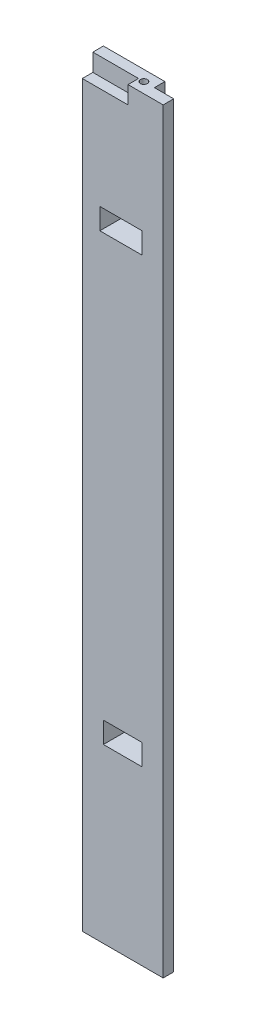
ISO-10303-21;
HEADER;
FILE_DESCRIPTION(('STEP AP214'),'2;1');
FILE_NAME('part.step','',(''),(''),'','','');
FILE_SCHEMA(('AUTOMOTIVE_DESIGN { 1 0 10303 214 1 1 1 1 }'));
ENDSEC;
DATA;
#1=APPLICATION_CONTEXT('core data for automotive mechanical design processes');
#2=APPLICATION_PROTOCOL_DEFINITION('international standard','automotive_design',2000,#1);
#3=PRODUCT_CONTEXT('',#1,'mechanical');
#4=PRODUCT('Part','Part','',(#3));
#5=PRODUCT_RELATED_PRODUCT_CATEGORY('part','',(#4));
#6=PRODUCT_DEFINITION_FORMATION('','',#4);
#7=PRODUCT_DEFINITION_CONTEXT('part definition',#1,'design');
#8=PRODUCT_DEFINITION('design','',#6,#7);
#9=PRODUCT_DEFINITION_SHAPE('','',#8);
#10=(LENGTH_UNIT() NAMED_UNIT(*) SI_UNIT(.MILLI.,.METRE.));
#11=(NAMED_UNIT(*) PLANE_ANGLE_UNIT() SI_UNIT($,.RADIAN.));
#12=(NAMED_UNIT(*) SI_UNIT($,.STERADIAN.) SOLID_ANGLE_UNIT());
#13=UNCERTAINTY_MEASURE_WITH_UNIT(LENGTH_MEASURE(1.E-05),#10,'distance_accuracy_value','');
#14=(GEOMETRIC_REPRESENTATION_CONTEXT(3) GLOBAL_UNCERTAINTY_ASSIGNED_CONTEXT((#13)) GLOBAL_UNIT_ASSIGNED_CONTEXT((#10,
#11,#12)) REPRESENTATION_CONTEXT('',''));
#15=CARTESIAN_POINT('',(0.,0.,0.));
#16=DIRECTION('',(0.,0.,1.));
#17=DIRECTION('',(1.,0.,0.));
#18=AXIS2_PLACEMENT_3D('',#15,#16,#17);
#19=CARTESIAN_POINT('',(23.,215.,0.));
#20=DIRECTION('',(0.,0.,-1.));
#21=DIRECTION('',(-1.,0.,0.));
#22=AXIS2_PLACEMENT_3D('',#19,#20,#21);
#23=PLANE('',#22);
#24=DIRECTION('',(-1.,0.,0.));
#25=VECTOR('',#24,1.);
#26=CARTESIAN_POINT('',(5.99999999998703,48.9999999999999,0.));
#27=LINE('',#26,#25);
#28=CARTESIAN_POINT('',(16.999999999987,48.9999999999999,0.));
#29=VERTEX_POINT('',#28);
#30=CARTESIAN_POINT('',(5.99999999998703,48.9999999999999,0.));
#31=VERTEX_POINT('',#30);
#32=EDGE_CURVE('E167',#29,#31,#27,.T.);
#33=ORIENTED_EDGE('',*,*,#32,.T.);
#34=DIRECTION('',(0.,1.,0.));
#35=VECTOR('',#34,1.);
#36=CARTESIAN_POINT('',(5.99999999998703,48.9999999999999,0.));
#37=LINE('',#36,#35);
#38=CARTESIAN_POINT('',(5.99999999998703,54.9999999999999,0.));
#39=VERTEX_POINT('',#38);
#40=EDGE_CURVE('E163',#31,#39,#37,.T.);
#41=ORIENTED_EDGE('',*,*,#40,.T.);
#42=DIRECTION('',(1.,0.,0.));
#43=VECTOR('',#42,1.);
#44=CARTESIAN_POINT('',(5.99999999998703,54.9999999999999,0.));
#45=LINE('',#44,#43);
#46=CARTESIAN_POINT('',(16.999999999987,54.9999999999999,0.));
#47=VERTEX_POINT('',#46);
#48=EDGE_CURVE('E170',#39,#47,#45,.T.);
#49=ORIENTED_EDGE('',*,*,#48,.T.);
#50=DIRECTION('',(0.,-1.,0.));
#51=VECTOR('',#50,1.);
#52=CARTESIAN_POINT('',(16.999999999987,48.9999999999999,0.));
#53=LINE('',#52,#51);
#54=EDGE_CURVE('E56',#47,#29,#53,.T.);
#55=ORIENTED_EDGE('',*,*,#54,.T.);
#56=EDGE_LOOP('',(#33,#41,#49,#55));
#57=FACE_BOUND('',#56,.T.);
#58=DIRECTION('',(-1.,0.,0.));
#59=VECTOR('',#58,1.);
#60=CARTESIAN_POINT('',(17.,180.999999999999,0.));
#61=LINE('',#60,#59);
#62=CARTESIAN_POINT('',(17.,180.999999999999,0.));
#63=VERTEX_POINT('',#62);
#64=CARTESIAN_POINT('',(5.,180.999999999999,0.));
#65=VERTEX_POINT('',#64);
#66=EDGE_CURVE('E239',#63,#65,#61,.T.);
#67=ORIENTED_EDGE('',*,*,#66,.F.);
#68=DIRECTION('',(0.,1.,0.));
#69=VECTOR('',#68,1.);
#70=CARTESIAN_POINT('',(17.,174.999999999999,0.));
#71=LINE('',#70,#69);
#72=CARTESIAN_POINT('',(17.,174.999999999999,0.));
#73=VERTEX_POINT('',#72);
#74=EDGE_CURVE('E206',#73,#63,#71,.T.);
#75=ORIENTED_EDGE('',*,*,#74,.F.);
#76=DIRECTION('',(1.,0.,0.));
#77=VECTOR('',#76,1.);
#78=CARTESIAN_POINT('',(17.,174.999999999999,0.));
#79=LINE('',#78,#77);
#80=CARTESIAN_POINT('',(5.,174.999999999999,0.));
#81=VERTEX_POINT('',#80);
#82=EDGE_CURVE('E215',#81,#73,#79,.T.);
#83=ORIENTED_EDGE('',*,*,#82,.F.);
#84=DIRECTION('',(0.,-1.,0.));
#85=VECTOR('',#84,1.);
#86=CARTESIAN_POINT('',(5.,174.999999999999,0.));
#87=LINE('',#86,#85);
#88=EDGE_CURVE('E250',#65,#81,#87,.T.);
#89=ORIENTED_EDGE('',*,*,#88,.F.);
#90=EDGE_LOOP('',(#67,#75,#83,#89));
#91=FACE_BOUND('',#90,.T.);
#92=DIRECTION('',(1.,0.,0.));
#93=VECTOR('',#92,1.);
#94=CARTESIAN_POINT('',(23.,215.,0.));
#95=LINE('',#94,#93);
#96=CARTESIAN_POINT('',(13.,215.,0.));
#97=VERTEX_POINT('',#96);
#98=CARTESIAN_POINT('',(23.,215.,0.));
#99=VERTEX_POINT('',#98);
#100=EDGE_CURVE('E321',#97,#99,#95,.T.);
#101=ORIENTED_EDGE('',*,*,#100,.F.);
#102=DIRECTION('',(0.,1.,0.));
#103=VECTOR('',#102,1.);
#104=CARTESIAN_POINT('',(13.,210.,0.));
#105=LINE('',#104,#103);
#106=CARTESIAN_POINT('',(13.,210.,0.));
#107=VERTEX_POINT('',#106);
#108=EDGE_CURVE('E338',#107,#97,#105,.T.);
#109=ORIENTED_EDGE('',*,*,#108,.F.);
#110=DIRECTION('',(1.,0.,0.));
#111=VECTOR('',#110,1.);
#112=CARTESIAN_POINT('',(0.,210.,0.));
#113=LINE('',#112,#111);
#114=CARTESIAN_POINT('',(0.,210.,0.));
#115=VERTEX_POINT('',#114);
#116=EDGE_CURVE('E263',#115,#107,#113,.T.);
#117=ORIENTED_EDGE('',*,*,#116,.F.);
#118=DIRECTION('',(0.,-1.,0.));
#119=VECTOR('',#118,1.);
#120=CARTESIAN_POINT('',(0.,215.,0.));
#121=LINE('',#120,#119);
#122=CARTESIAN_POINT('',(0.,0.,0.));
#123=VERTEX_POINT('',#122);
#124=EDGE_CURVE('E277',#115,#123,#121,.T.);
#125=ORIENTED_EDGE('',*,*,#124,.T.);
#126=DIRECTION('',(1.,0.,0.));
#127=VECTOR('',#126,1.);
#128=CARTESIAN_POINT('',(23.,0.,0.));
#129=LINE('',#128,#127);
#130=CARTESIAN_POINT('',(23.,0.,0.));
#131=VERTEX_POINT('',#130);
#132=EDGE_CURVE('E302',#123,#131,#129,.T.);
#133=ORIENTED_EDGE('',*,*,#132,.T.);
#134=DIRECTION('',(0.,-1.,0.));
#135=VECTOR('',#134,1.);
#136=CARTESIAN_POINT('',(23.,215.,0.));
#137=LINE('',#136,#135);
#138=EDGE_CURVE('E534',#99,#131,#137,.T.);
#139=ORIENTED_EDGE('',*,*,#138,.F.);
#140=EDGE_LOOP('',(#101,#109,#117,#125,#133,#139));
#141=FACE_BOUND('',#140,.T.);
#142=ADVANCED_FACE('F40',(#57,#91,#141),#23,.F.);
#143=CARTESIAN_POINT('',(23.,215.,-3.));
#144=DIRECTION('',(-1.,0.,0.));
#145=DIRECTION('',(0.,0.,1.));
#146=AXIS2_PLACEMENT_3D('',#143,#144,#145);
#147=PLANE('',#146);
#148=DIRECTION('',(0.,0.,-1.));
#149=VECTOR('',#148,1.);
#150=CARTESIAN_POINT('',(23.,0.,-3.));
#151=LINE('',#150,#149);
#152=CARTESIAN_POINT('',(23.,0.,-3.));
#153=VERTEX_POINT('',#152);
#154=EDGE_CURVE('E307',#131,#153,#151,.T.);
#155=ORIENTED_EDGE('',*,*,#154,.T.);
#156=DIRECTION('',(0.,-1.,0.));
#157=VECTOR('',#156,1.);
#158=CARTESIAN_POINT('',(23.,215.,-3.));
#159=LINE('',#158,#157);
#160=CARTESIAN_POINT('',(23.,215.,-3.));
#161=VERTEX_POINT('',#160);
#162=EDGE_CURVE('E540',#161,#153,#159,.T.);
#163=ORIENTED_EDGE('',*,*,#162,.F.);
#164=DIRECTION('',(0.,0.,-1.));
#165=VECTOR('',#164,1.);
#166=CARTESIAN_POINT('',(23.,215.,-3.));
#167=LINE('',#166,#165);
#168=EDGE_CURVE('E327',#99,#161,#167,.T.);
#169=ORIENTED_EDGE('',*,*,#168,.F.);
#170=ORIENTED_EDGE('',*,*,#138,.T.);
#171=EDGE_LOOP('',(#155,#163,#169,#170));
#172=FACE_BOUND('',#171,.T.);
#173=ADVANCED_FACE('F388',(#172),#147,.F.);
#174=CARTESIAN_POINT('',(17.5,215.,-3.));
#175=DIRECTION('',(0.,0.,1.));
#176=DIRECTION('',(1.,0.,0.));
#177=AXIS2_PLACEMENT_3D('',#174,#175,#176);
#178=PLANE('',#177);
#179=DIRECTION('',(-1.,0.,0.));
#180=VECTOR('',#179,1.);
#181=CARTESIAN_POINT('',(17.5,0.,-3.));
#182=LINE('',#181,#180);
#183=CARTESIAN_POINT('',(17.5,0.,-3.));
#184=VERTEX_POINT('',#183);
#185=EDGE_CURVE('E310',#153,#184,#182,.T.);
#186=ORIENTED_EDGE('',*,*,#185,.T.);
#187=DIRECTION('',(0.,-1.,0.));
#188=VECTOR('',#187,1.);
#189=CARTESIAN_POINT('',(17.5,215.,-3.));
#190=LINE('',#189,#188);
#191=CARTESIAN_POINT('',(17.5,215.,-3.));
#192=VERTEX_POINT('',#191);
#193=EDGE_CURVE('E352',#192,#184,#190,.T.);
#194=ORIENTED_EDGE('',*,*,#193,.F.);
#195=DIRECTION('',(-1.,0.,0.));
#196=VECTOR('',#195,1.);
#197=CARTESIAN_POINT('',(17.5,215.,-3.));
#198=LINE('',#197,#196);
#199=EDGE_CURVE('E335',#161,#192,#198,.T.);
#200=ORIENTED_EDGE('',*,*,#199,.F.);
#201=ORIENTED_EDGE('',*,*,#162,.T.);
#202=EDGE_LOOP('',(#186,#194,#200,#201));
#203=FACE_BOUND('',#202,.T.);
#204=ADVANCED_FACE('F392',(#203),#178,.F.);
#205=CARTESIAN_POINT('',(17.5,215.,-6.));
#206=DIRECTION('',(-1.,0.,0.));
#207=DIRECTION('',(0.,0.,1.));
#208=AXIS2_PLACEMENT_3D('',#205,#206,#207);
#209=PLANE('',#208);
#210=DIRECTION('',(0.,0.,-1.));
#211=VECTOR('',#210,1.);
#212=CARTESIAN_POINT('',(17.5,0.,-6.));
#213=LINE('',#212,#211);
#214=CARTESIAN_POINT('',(17.5,0.,-6.));
#215=VERTEX_POINT('',#214);
#216=EDGE_CURVE('E312',#184,#215,#213,.T.);
#217=ORIENTED_EDGE('',*,*,#216,.T.);
#218=DIRECTION('',(0.,-1.,0.));
#219=VECTOR('',#218,1.);
#220=CARTESIAN_POINT('',(17.5,215.,-6.));
#221=LINE('',#220,#219);
#222=CARTESIAN_POINT('',(17.5,215.,-6.));
#223=VERTEX_POINT('',#222);
#224=EDGE_CURVE('E289',#223,#215,#221,.T.);
#225=ORIENTED_EDGE('',*,*,#224,.F.);
#226=DIRECTION('',(0.,0.,-1.));
#227=VECTOR('',#226,1.);
#228=CARTESIAN_POINT('',(17.5,215.,-6.));
#229=LINE('',#228,#227);
#230=EDGE_CURVE('E299',#192,#223,#229,.T.);
#231=ORIENTED_EDGE('',*,*,#230,.F.);
#232=ORIENTED_EDGE('',*,*,#193,.T.);
#233=EDGE_LOOP('',(#217,#225,#231,#232));
#234=FACE_BOUND('',#233,.T.);
#235=ADVANCED_FACE('F349',(#234),#209,.F.);
#236=CARTESIAN_POINT('',(0.,215.,-6.));
#237=DIRECTION('',(0.,0.,1.));
#238=DIRECTION('',(1.,0.,0.));
#239=AXIS2_PLACEMENT_3D('',#236,#237,#238);
#240=PLANE('',#239);
#241=DIRECTION('',(-1.,0.,0.));
#242=VECTOR('',#241,1.);
#243=CARTESIAN_POINT('',(0.,54.9999999999999,-6.));
#244=LINE('',#243,#242);
#245=CARTESIAN_POINT('',(16.999999999987,54.9999999999999,-6.));
#246=VERTEX_POINT('',#245);
#247=CARTESIAN_POINT('',(5.99999999998703,54.9999999999999,-6.));
#248=VERTEX_POINT('',#247);
#249=EDGE_CURVE('E532',#246,#248,#244,.T.);
#250=ORIENTED_EDGE('',*,*,#249,.T.);
#251=DIRECTION('',(0.,-1.,0.));
#252=VECTOR('',#251,1.);
#253=CARTESIAN_POINT('',(5.99999999998703,215.,-6.));
#254=LINE('',#253,#252);
#255=CARTESIAN_POINT('',(5.99999999998703,48.9999999999999,-6.));
#256=VERTEX_POINT('',#255);
#257=EDGE_CURVE('E12',#248,#256,#254,.T.);
#258=ORIENTED_EDGE('',*,*,#257,.T.);
#259=DIRECTION('',(1.,0.,0.));
#260=VECTOR('',#259,1.);
#261=CARTESIAN_POINT('',(0.,48.9999999999999,-6.));
#262=LINE('',#261,#260);
#263=CARTESIAN_POINT('',(16.999999999987,48.9999999999999,-6.));
#264=VERTEX_POINT('',#263);
#265=EDGE_CURVE('E49',#256,#264,#262,.T.);
#266=ORIENTED_EDGE('',*,*,#265,.T.);
#267=DIRECTION('',(0.,1.,0.));
#268=VECTOR('',#267,1.);
#269=CARTESIAN_POINT('',(16.999999999987,215.,-6.));
#270=LINE('',#269,#268);
#271=EDGE_CURVE('E529',#264,#246,#270,.T.);
#272=ORIENTED_EDGE('',*,*,#271,.T.);
#273=EDGE_LOOP('',(#250,#258,#266,#272));
#274=FACE_BOUND('',#273,.T.);
#275=DIRECTION('',(1.,0.,0.));
#276=VECTOR('',#275,1.);
#277=CARTESIAN_POINT('',(17.,174.999999999999,-6.));
#278=LINE('',#277,#276);
#279=CARTESIAN_POINT('',(5.,174.999999999999,-6.));
#280=VERTEX_POINT('',#279);
#281=CARTESIAN_POINT('',(17.,174.999999999999,-6.));
#282=VERTEX_POINT('',#281);
#283=EDGE_CURVE('E231',#280,#282,#278,.T.);
#284=ORIENTED_EDGE('',*,*,#283,.T.);
#285=DIRECTION('',(0.,1.,0.));
#286=VECTOR('',#285,1.);
#287=CARTESIAN_POINT('',(17.,174.999999999999,-6.));
#288=LINE('',#287,#286);
#289=CARTESIAN_POINT('',(17.,180.999999999999,-6.));
#290=VERTEX_POINT('',#289);
#291=EDGE_CURVE('E209',#282,#290,#288,.T.);
#292=ORIENTED_EDGE('',*,*,#291,.T.);
#293=DIRECTION('',(-1.,0.,0.));
#294=VECTOR('',#293,1.);
#295=CARTESIAN_POINT('',(17.,180.999999999999,-6.));
#296=LINE('',#295,#294);
#297=CARTESIAN_POINT('',(5.,180.999999999999,-6.));
#298=VERTEX_POINT('',#297);
#299=EDGE_CURVE('E214',#290,#298,#296,.T.);
#300=ORIENTED_EDGE('',*,*,#299,.T.);
#301=DIRECTION('',(0.,-1.,0.));
#302=VECTOR('',#301,1.);
#303=CARTESIAN_POINT('',(5.,174.999999999999,-6.));
#304=LINE('',#303,#302);
#305=EDGE_CURVE('E227',#298,#280,#304,.T.);
#306=ORIENTED_EDGE('',*,*,#305,.T.);
#307=EDGE_LOOP('',(#284,#292,#300,#306));
#308=FACE_BOUND('',#307,.T.);
#309=DIRECTION('',(-1.,0.,0.));
#310=VECTOR('',#309,1.);
#311=CARTESIAN_POINT('',(0.,0.,-6.));
#312=LINE('',#311,#310);
#313=CARTESIAN_POINT('',(0.,0.,-6.));
#314=VERTEX_POINT('',#313);
#315=EDGE_CURVE('E313',#215,#314,#312,.T.);
#316=ORIENTED_EDGE('',*,*,#315,.T.);
#317=DIRECTION('',(0.,-1.,0.));
#318=VECTOR('',#317,1.);
#319=CARTESIAN_POINT('',(0.,215.,-6.));
#320=LINE('',#319,#318);
#321=CARTESIAN_POINT('',(0.,215.,-6.));
#322=VERTEX_POINT('',#321);
#323=EDGE_CURVE('E282',#322,#314,#320,.T.);
#324=ORIENTED_EDGE('',*,*,#323,.F.);
#325=DIRECTION('',(-1.,0.,0.));
#326=VECTOR('',#325,1.);
#327=CARTESIAN_POINT('',(0.,215.,-6.));
#328=LINE('',#327,#326);
#329=EDGE_CURVE('E294',#223,#322,#328,.T.);
#330=ORIENTED_EDGE('',*,*,#329,.F.);
#331=ORIENTED_EDGE('',*,*,#224,.T.);
#332=EDGE_LOOP('',(#316,#324,#330,#331));
#333=FACE_BOUND('',#332,.T.);
#334=ADVANCED_FACE('F353',(#274,#308,#333),#240,.F.);
#335=CARTESIAN_POINT('',(0.,215.,0.));
#336=DIRECTION('',(1.,0.,0.));
#337=DIRECTION('',(0.,0.,-1.));
#338=AXIS2_PLACEMENT_3D('',#335,#336,#337);
#339=PLANE('',#338);
#340=DIRECTION('',(0.,0.,1.));
#341=VECTOR('',#340,1.);
#342=CARTESIAN_POINT('',(0.,210.,0.));
#343=LINE('',#342,#341);
#344=CARTESIAN_POINT('',(0.,210.,-3.));
#345=VERTEX_POINT('',#344);
#346=EDGE_CURVE('E261',#345,#115,#343,.T.);
#347=ORIENTED_EDGE('',*,*,#346,.F.);
#348=DIRECTION('',(0.,1.,0.));
#349=VECTOR('',#348,1.);
#350=CARTESIAN_POINT('',(0.,210.,-3.));
#351=LINE('',#350,#349);
#352=CARTESIAN_POINT('',(0.,215.,-3.));
#353=VERTEX_POINT('',#352);
#354=EDGE_CURVE('E308',#345,#353,#351,.T.);
#355=ORIENTED_EDGE('',*,*,#354,.T.);
#356=DIRECTION('',(0.,0.,1.));
#357=VECTOR('',#356,1.);
#358=CARTESIAN_POINT('',(0.,215.,0.));
#359=LINE('',#358,#357);
#360=EDGE_CURVE('E283',#322,#353,#359,.T.);
#361=ORIENTED_EDGE('',*,*,#360,.F.);
#362=ORIENTED_EDGE('',*,*,#323,.T.);
#363=DIRECTION('',(0.,0.,1.));
#364=VECTOR('',#363,1.);
#365=CARTESIAN_POINT('',(0.,0.,0.));
#366=LINE('',#365,#364);
#367=EDGE_CURVE('E284',#314,#123,#366,.T.);
#368=ORIENTED_EDGE('',*,*,#367,.T.);
#369=ORIENTED_EDGE('',*,*,#124,.F.);
#370=EDGE_LOOP('',(#347,#355,#361,#362,#368,#369));
#371=FACE_BOUND('',#370,.T.);
#372=ADVANCED_FACE('F357',(#371),#339,.F.);
#373=CARTESIAN_POINT('',(0.,215.,0.));
#374=DIRECTION('',(0.,-1.,0.));
#375=DIRECTION('',(0.,0.,-1.));
#376=AXIS2_PLACEMENT_3D('',#373,#374,#375);
#377=PLANE('',#376);
#378=CARTESIAN_POINT('',(14.5,215.,-3.));
#379=DIRECTION('',(0.,1.,0.));
#380=DIRECTION('',(0.,0.,1.));
#381=AXIS2_PLACEMENT_3D('',#378,#379,#380);
#382=CIRCLE('',#381,1.);
#383=CARTESIAN_POINT('',(14.5,215.,-2.));
#384=VERTEX_POINT('',#383);
#385=EDGE_CURVE('E198',#384,#384,#382,.T.);
#386=ORIENTED_EDGE('',*,*,#385,.F.);
#387=EDGE_LOOP('',(#386));
#388=FACE_BOUND('',#387,.T.);
#389=ORIENTED_EDGE('',*,*,#360,.T.);
#390=DIRECTION('',(-1.,0.,0.));
#391=VECTOR('',#390,1.);
#392=CARTESIAN_POINT('',(0.,215.,-3.));
#393=LINE('',#392,#391);
#394=CARTESIAN_POINT('',(13.,215.,-3.));
#395=VERTEX_POINT('',#394);
#396=EDGE_CURVE('E264',#395,#353,#393,.T.);
#397=ORIENTED_EDGE('',*,*,#396,.F.);
#398=DIRECTION('',(0.,0.,-1.));
#399=VECTOR('',#398,1.);
#400=CARTESIAN_POINT('',(13.,215.,0.));
#401=LINE('',#400,#399);
#402=EDGE_CURVE('E254',#97,#395,#401,.T.);
#403=ORIENTED_EDGE('',*,*,#402,.F.);
#404=ORIENTED_EDGE('',*,*,#100,.T.);
#405=ORIENTED_EDGE('',*,*,#168,.T.);
#406=ORIENTED_EDGE('',*,*,#199,.T.);
#407=ORIENTED_EDGE('',*,*,#230,.T.);
#408=ORIENTED_EDGE('',*,*,#329,.T.);
#409=EDGE_LOOP('',(#389,#397,#403,#404,#405,#406,#407,#408));
#410=FACE_BOUND('',#409,.T.);
#411=ADVANCED_FACE('F345',(#388,#410),#377,.F.);
#412=CARTESIAN_POINT('',(0.,0.,0.));
#413=DIRECTION('',(0.,-1.,0.));
#414=DIRECTION('',(0.,0.,-1.));
#415=AXIS2_PLACEMENT_3D('',#412,#413,#414);
#416=PLANE('',#415);
#417=ORIENTED_EDGE('',*,*,#132,.F.);
#418=ORIENTED_EDGE('',*,*,#367,.F.);
#419=ORIENTED_EDGE('',*,*,#315,.F.);
#420=ORIENTED_EDGE('',*,*,#216,.F.);
#421=ORIENTED_EDGE('',*,*,#185,.F.);
#422=ORIENTED_EDGE('',*,*,#154,.F.);
#423=EDGE_LOOP('',(#417,#418,#419,#420,#421,#422));
#424=FACE_BOUND('',#423,.T.);
#425=ADVANCED_FACE('F377',(#424),#416,.T.);
#426=CARTESIAN_POINT('',(0.,210.,-3.));
#427=DIRECTION('',(0.,0.,-1.));
#428=DIRECTION('',(-1.,0.,0.));
#429=AXIS2_PLACEMENT_3D('',#426,#427,#428);
#430=PLANE('',#429);
#431=ORIENTED_EDGE('',*,*,#396,.T.);
#432=ORIENTED_EDGE('',*,*,#354,.F.);
#433=DIRECTION('',(-1.,0.,0.));
#434=VECTOR('',#433,1.);
#435=CARTESIAN_POINT('',(0.,210.,-3.));
#436=LINE('',#435,#434);
#437=CARTESIAN_POINT('',(13.,210.,-3.));
#438=VERTEX_POINT('',#437);
#439=EDGE_CURVE('E366',#438,#345,#436,.T.);
#440=ORIENTED_EDGE('',*,*,#439,.F.);
#441=DIRECTION('',(0.,1.,0.));
#442=VECTOR('',#441,1.);
#443=CARTESIAN_POINT('',(13.,210.,-3.));
#444=LINE('',#443,#442);
#445=EDGE_CURVE('E364',#438,#395,#444,.T.);
#446=ORIENTED_EDGE('',*,*,#445,.T.);
#447=EDGE_LOOP('',(#431,#432,#440,#446));
#448=FACE_BOUND('',#447,.T.);
#449=ADVANCED_FACE('F374',(#448),#430,.F.);
#450=CARTESIAN_POINT('',(13.,210.,0.));
#451=DIRECTION('',(1.,0.,0.));
#452=DIRECTION('',(0.,0.,-1.));
#453=AXIS2_PLACEMENT_3D('',#450,#451,#452);
#454=PLANE('',#453);
#455=ORIENTED_EDGE('',*,*,#402,.T.);
#456=ORIENTED_EDGE('',*,*,#445,.F.);
#457=DIRECTION('',(0.,0.,-1.));
#458=VECTOR('',#457,1.);
#459=CARTESIAN_POINT('',(13.,210.,0.));
#460=LINE('',#459,#458);
#461=EDGE_CURVE('E269',#107,#438,#460,.T.);
#462=ORIENTED_EDGE('',*,*,#461,.F.);
#463=ORIENTED_EDGE('',*,*,#108,.T.);
#464=EDGE_LOOP('',(#455,#456,#462,#463));
#465=FACE_BOUND('',#464,.T.);
#466=ADVANCED_FACE('F376',(#465),#454,.F.);
#467=CARTESIAN_POINT('',(0.,210.,0.));
#468=DIRECTION('',(0.,-1.,0.));
#469=DIRECTION('',(0.,0.,-1.));
#470=AXIS2_PLACEMENT_3D('',#467,#468,#469);
#471=PLANE('',#470);
#472=ORIENTED_EDGE('',*,*,#346,.T.);
#473=ORIENTED_EDGE('',*,*,#116,.T.);
#474=ORIENTED_EDGE('',*,*,#461,.T.);
#475=ORIENTED_EDGE('',*,*,#439,.T.);
#476=EDGE_LOOP('',(#472,#473,#474,#475));
#477=FACE_BOUND('',#476,.T.);
#478=ADVANCED_FACE('F372',(#477),#471,.F.);
#479=CARTESIAN_POINT('',(17.,174.999999999999,-6.));
#480=DIRECTION('',(1.,0.,0.));
#481=DIRECTION('',(0.,0.,-1.));
#482=AXIS2_PLACEMENT_3D('',#479,#480,#481);
#483=PLANE('',#482);
#484=ORIENTED_EDGE('',*,*,#74,.T.);
#485=DIRECTION('',(0.,0.,1.));
#486=VECTOR('',#485,1.);
#487=CARTESIAN_POINT('',(17.,180.999999999999,-6.));
#488=LINE('',#487,#486);
#489=EDGE_CURVE('E236',#290,#63,#488,.T.);
#490=ORIENTED_EDGE('',*,*,#489,.F.);
#491=ORIENTED_EDGE('',*,*,#291,.F.);
#492=DIRECTION('',(0.,0.,1.));
#493=VECTOR('',#492,1.);
#494=CARTESIAN_POINT('',(17.,174.999999999999,-6.));
#495=LINE('',#494,#493);
#496=EDGE_CURVE('E252',#282,#73,#495,.T.);
#497=ORIENTED_EDGE('',*,*,#496,.T.);
#498=EDGE_LOOP('',(#484,#490,#491,#497));
#499=FACE_BOUND('',#498,.T.);
#500=ADVANCED_FACE('F434',(#499),#483,.F.);
#501=CARTESIAN_POINT('',(17.,174.999999999999,-6.));
#502=DIRECTION('',(0.,-1.,0.));
#503=DIRECTION('',(0.,0.,-1.));
#504=AXIS2_PLACEMENT_3D('',#501,#502,#503);
#505=PLANE('',#504);
#506=ORIENTED_EDGE('',*,*,#82,.T.);
#507=ORIENTED_EDGE('',*,*,#496,.F.);
#508=ORIENTED_EDGE('',*,*,#283,.F.);
#509=DIRECTION('',(0.,0.,1.));
#510=VECTOR('',#509,1.);
#511=CARTESIAN_POINT('',(5.,174.999999999999,-6.));
#512=LINE('',#511,#510);
#513=EDGE_CURVE('E255',#280,#81,#512,.T.);
#514=ORIENTED_EDGE('',*,*,#513,.T.);
#515=EDGE_LOOP('',(#506,#507,#508,#514));
#516=FACE_BOUND('',#515,.T.);
#517=ADVANCED_FACE('F431',(#516),#505,.F.);
#518=CARTESIAN_POINT('',(5.,174.999999999999,-6.));
#519=DIRECTION('',(-1.,0.,0.));
#520=DIRECTION('',(0.,0.,1.));
#521=AXIS2_PLACEMENT_3D('',#518,#519,#520);
#522=PLANE('',#521);
#523=ORIENTED_EDGE('',*,*,#88,.T.);
#524=ORIENTED_EDGE('',*,*,#513,.F.);
#525=ORIENTED_EDGE('',*,*,#305,.F.);
#526=DIRECTION('',(0.,0.,1.));
#527=VECTOR('',#526,1.);
#528=CARTESIAN_POINT('',(5.,180.999999999999,-6.));
#529=LINE('',#528,#527);
#530=EDGE_CURVE('E257',#298,#65,#529,.T.);
#531=ORIENTED_EDGE('',*,*,#530,.T.);
#532=EDGE_LOOP('',(#523,#524,#525,#531));
#533=FACE_BOUND('',#532,.T.);
#534=ADVANCED_FACE('F425',(#533),#522,.F.);
#535=CARTESIAN_POINT('',(17.,180.999999999999,-6.));
#536=DIRECTION('',(0.,1.,0.));
#537=DIRECTION('',(-1.,0.,0.));
#538=AXIS2_PLACEMENT_3D('',#535,#536,#537);
#539=PLANE('',#538);
#540=ORIENTED_EDGE('',*,*,#66,.T.);
#541=ORIENTED_EDGE('',*,*,#530,.F.);
#542=ORIENTED_EDGE('',*,*,#299,.F.);
#543=ORIENTED_EDGE('',*,*,#489,.T.);
#544=EDGE_LOOP('',(#540,#541,#542,#543));
#545=FACE_BOUND('',#544,.T.);
#546=ADVANCED_FACE('F416',(#545),#539,.F.);
#547=CARTESIAN_POINT('',(14.5,205.,-3.));
#548=DIRECTION('',(0.,1.,0.));
#549=DIRECTION('',(0.,0.,1.));
#550=AXIS2_PLACEMENT_3D('',#547,#548,#549);
#551=CYLINDRICAL_SURFACE('',#550,1.);
#552=CARTESIAN_POINT('',(14.5,205.,-3.));
#553=DIRECTION('',(0.,1.,0.));
#554=DIRECTION('',(0.,0.,1.));
#555=AXIS2_PLACEMENT_3D('',#552,#553,#554);
#556=CIRCLE('',#555,1.);
#557=CARTESIAN_POINT('',(14.5,205.,-2.));
#558=VERTEX_POINT('',#557);
#559=EDGE_CURVE('E203',#558,#558,#556,.T.);
#560=ORIENTED_EDGE('',*,*,#559,.F.);
#561=EDGE_LOOP('',(#560));
#562=FACE_BOUND('',#561,.T.);
#563=ORIENTED_EDGE('',*,*,#385,.T.);
#564=EDGE_LOOP('',(#563));
#565=FACE_BOUND('',#564,.T.);
#566=ADVANCED_FACE('F413',(#562,#565),#551,.F.);
#567=CARTESIAN_POINT('',(14.5,205.,-3.));
#568=DIRECTION('',(0.,1.,0.));
#569=DIRECTION('',(0.,0.,1.));
#570=AXIS2_PLACEMENT_3D('',#567,#568,#569);
#571=PLANE('',#570);
#572=ORIENTED_EDGE('',*,*,#559,.T.);
#573=EDGE_LOOP('',(#572));
#574=FACE_BOUND('',#573,.T.);
#575=ADVANCED_FACE('F415',(#574),#571,.T.);
#576=CARTESIAN_POINT('',(5.99999999998703,48.9999999999999,0.));
#577=DIRECTION('',(-1.,0.,0.));
#578=DIRECTION('',(0.,0.,1.));
#579=AXIS2_PLACEMENT_3D('',#576,#577,#578);
#580=PLANE('',#579);
#581=DIRECTION('',(0.,0.,-1.));
#582=VECTOR('',#581,1.);
#583=CARTESIAN_POINT('',(5.99999999998703,54.9999999999999,0.));
#584=LINE('',#583,#582);
#585=EDGE_CURVE('E64',#39,#248,#584,.T.);
#586=ORIENTED_EDGE('',*,*,#585,.F.);
#587=ORIENTED_EDGE('',*,*,#40,.F.);
#588=DIRECTION('',(0.,0.,-1.));
#589=VECTOR('',#588,1.);
#590=CARTESIAN_POINT('',(5.99999999998703,48.9999999999999,0.));
#591=LINE('',#590,#589);
#592=EDGE_CURVE('E196',#31,#256,#591,.T.);
#593=ORIENTED_EDGE('',*,*,#592,.T.);
#594=ORIENTED_EDGE('',*,*,#257,.F.);
#595=EDGE_LOOP('',(#586,#587,#593,#594));
#596=FACE_BOUND('',#595,.T.);
#597=ADVANCED_FACE('F160',(#596),#580,.F.);
#598=CARTESIAN_POINT('',(5.99999999998703,48.9999999999999,0.));
#599=DIRECTION('',(0.,-1.,0.));
#600=DIRECTION('',(0.,0.,-1.));
#601=AXIS2_PLACEMENT_3D('',#598,#599,#600);
#602=PLANE('',#601);
#603=ORIENTED_EDGE('',*,*,#592,.F.);
#604=ORIENTED_EDGE('',*,*,#32,.F.);
#605=DIRECTION('',(0.,0.,-1.));
#606=VECTOR('',#605,1.);
#607=CARTESIAN_POINT('',(16.999999999987,48.9999999999999,0.));
#608=LINE('',#607,#606);
#609=EDGE_CURVE('E199',#29,#264,#608,.T.);
#610=ORIENTED_EDGE('',*,*,#609,.T.);
#611=ORIENTED_EDGE('',*,*,#265,.F.);
#612=EDGE_LOOP('',(#603,#604,#610,#611));
#613=FACE_BOUND('',#612,.T.);
#614=ADVANCED_FACE('F499',(#613),#602,.F.);
#615=CARTESIAN_POINT('',(16.999999999987,48.9999999999999,0.));
#616=DIRECTION('',(1.,0.,0.));
#617=DIRECTION('',(0.,0.,-1.));
#618=AXIS2_PLACEMENT_3D('',#615,#616,#617);
#619=PLANE('',#618);
#620=ORIENTED_EDGE('',*,*,#609,.F.);
#621=ORIENTED_EDGE('',*,*,#54,.F.);
#622=DIRECTION('',(0.,0.,-1.));
#623=VECTOR('',#622,1.);
#624=CARTESIAN_POINT('',(16.999999999987,54.9999999999999,0.));
#625=LINE('',#624,#623);
#626=EDGE_CURVE('E166',#47,#246,#625,.T.);
#627=ORIENTED_EDGE('',*,*,#626,.T.);
#628=ORIENTED_EDGE('',*,*,#271,.F.);
#629=EDGE_LOOP('',(#620,#621,#627,#628));
#630=FACE_BOUND('',#629,.T.);
#631=ADVANCED_FACE('F507',(#630),#619,.F.);
#632=CARTESIAN_POINT('',(5.99999999998703,54.9999999999999,0.));
#633=DIRECTION('',(0.,1.,0.));
#634=DIRECTION('',(0.,0.,1.));
#635=AXIS2_PLACEMENT_3D('',#632,#633,#634);
#636=PLANE('',#635);
#637=ORIENTED_EDGE('',*,*,#626,.F.);
#638=ORIENTED_EDGE('',*,*,#48,.F.);
#639=ORIENTED_EDGE('',*,*,#585,.T.);
#640=ORIENTED_EDGE('',*,*,#249,.F.);
#641=EDGE_LOOP('',(#637,#638,#639,#640));
#642=FACE_BOUND('',#641,.T.);
#643=ADVANCED_FACE('F171',(#642),#636,.F.);
#644=CLOSED_SHELL('',(#142,#173,#204,#235,#334,#372,#411,#425,#449,#466,#478,#500,#517,#534,
#546,#566,#575,#597,#614,#631,#643));
#645=MANIFOLD_SOLID_BREP('B2',#644);
#646=ADVANCED_BREP_SHAPE_REPRESENTATION('',(#18,#645),#14);
#647=SHAPE_DEFINITION_REPRESENTATION(#9,#646);
ENDSEC;
END-ISO-10303-21;
